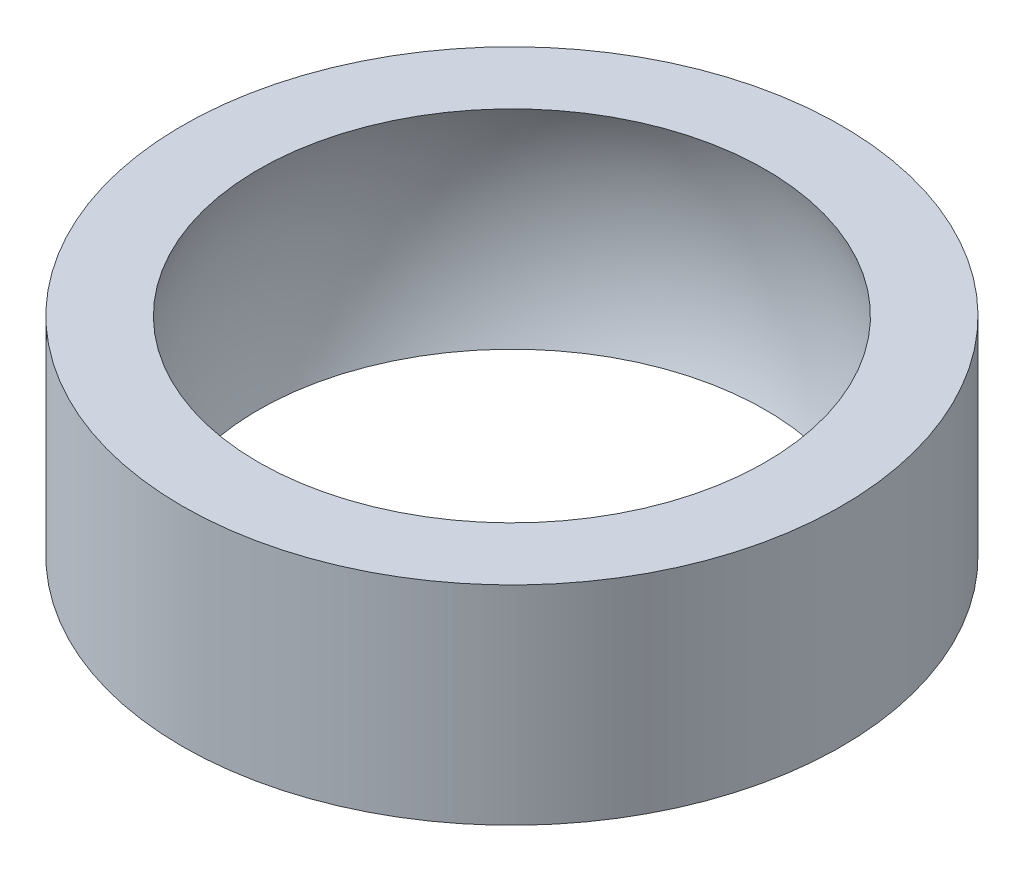
ISO-10303-21;
HEADER;
FILE_DESCRIPTION(('STEP AP214'),'2;1');
FILE_NAME('part.step','',(''),(''),'','','');
FILE_SCHEMA(('AUTOMOTIVE_DESIGN { 1 0 10303 214 1 1 1 1 }'));
ENDSEC;
DATA;
#1=APPLICATION_CONTEXT('core data for automotive mechanical design processes');
#2=APPLICATION_PROTOCOL_DEFINITION('international standard','automotive_design',2000,#1);
#3=PRODUCT_CONTEXT('',#1,'mechanical');
#4=PRODUCT('Part','Part','',(#3));
#5=PRODUCT_RELATED_PRODUCT_CATEGORY('part','',(#4));
#6=PRODUCT_DEFINITION_FORMATION('','',#4);
#7=PRODUCT_DEFINITION_CONTEXT('part definition',#1,'design');
#8=PRODUCT_DEFINITION('design','',#6,#7);
#9=PRODUCT_DEFINITION_SHAPE('','',#8);
#10=(LENGTH_UNIT() NAMED_UNIT(*) SI_UNIT(.MILLI.,.METRE.));
#11=(NAMED_UNIT(*) PLANE_ANGLE_UNIT() SI_UNIT($,.RADIAN.));
#12=(NAMED_UNIT(*) SI_UNIT($,.STERADIAN.) SOLID_ANGLE_UNIT());
#13=UNCERTAINTY_MEASURE_WITH_UNIT(LENGTH_MEASURE(1.E-05),#10,'distance_accuracy_value','');
#14=(GEOMETRIC_REPRESENTATION_CONTEXT(3) GLOBAL_UNCERTAINTY_ASSIGNED_CONTEXT((#13)) GLOBAL_UNIT_ASSIGNED_CONTEXT((#10,
#11,#12)) REPRESENTATION_CONTEXT('',''));
#15=CARTESIAN_POINT('',(0.,0.,0.));
#16=DIRECTION('',(0.,0.,1.));
#17=DIRECTION('',(1.,0.,0.));
#18=AXIS2_PLACEMENT_3D('',#15,#16,#17);
#19=CARTESIAN_POINT('',(0.,3.,0.));
#20=DIRECTION('',(0.,-1.,0.));
#21=DIRECTION('',(0.,0.,-1.));
#22=AXIS2_PLACEMENT_3D('',#19,#20,#21);
#23=CYLINDRICAL_SURFACE('',#22,9.5);
#24=CARTESIAN_POINT('',(0.,3.,0.));
#25=DIRECTION('',(0.,1.,0.));
#26=DIRECTION('',(0.,0.,1.));
#27=AXIS2_PLACEMENT_3D('',#24,#25,#26);
#28=CIRCLE('',#27,9.5);
#29=CARTESIAN_POINT('',(0.,3.,9.5));
#30=VERTEX_POINT('',#29);
#31=EDGE_CURVE('E10',#30,#30,#28,.T.);
#32=ORIENTED_EDGE('',*,*,#31,.F.);
#33=EDGE_LOOP('',(#32));
#34=FACE_BOUND('',#33,.T.);
#35=CARTESIAN_POINT('',(0.,-3.,0.));
#36=DIRECTION('',(0.,1.,0.));
#37=DIRECTION('',(0.,0.,1.));
#38=AXIS2_PLACEMENT_3D('',#35,#36,#37);
#39=CIRCLE('',#38,9.5);
#40=CARTESIAN_POINT('',(0.,-3.,9.5));
#41=VERTEX_POINT('',#40);
#42=EDGE_CURVE('E48',#41,#41,#39,.T.);
#43=ORIENTED_EDGE('',*,*,#42,.T.);
#44=EDGE_LOOP('',(#43));
#45=FACE_BOUND('',#44,.T.);
#46=ADVANCED_FACE('F41',(#34,#45),#23,.T.);
#47=CARTESIAN_POINT('',(0.,3.,0.));
#48=DIRECTION('',(0.,1.,0.));
#49=DIRECTION('',(0.,0.,1.));
#50=AXIS2_PLACEMENT_3D('',#47,#48,#49);
#51=PLANE('',#50);
#52=CARTESIAN_POINT('',(0.,3.,0.));
#53=DIRECTION('',(0.,1.,0.));
#54=DIRECTION('',(0.,0.,1.));
#55=AXIS2_PLACEMENT_3D('',#52,#53,#54);
#56=CIRCLE('',#55,7.30821455623739);
#57=CARTESIAN_POINT('',(0.,3.,7.30821455623739));
#58=VERTEX_POINT('',#57);
#59=EDGE_CURVE('E53',#58,#58,#56,.T.);
#60=ORIENTED_EDGE('',*,*,#59,.F.);
#61=EDGE_LOOP('',(#60));
#62=FACE_BOUND('',#61,.T.);
#63=ORIENTED_EDGE('',*,*,#31,.T.);
#64=EDGE_LOOP('',(#63));
#65=FACE_BOUND('',#64,.T.);
#66=ADVANCED_FACE('F70',(#62,#65),#51,.T.);
#67=CARTESIAN_POINT('',(0.,-3.,0.));
#68=DIRECTION('',(0.,1.,0.));
#69=DIRECTION('',(0.,0.,1.));
#70=AXIS2_PLACEMENT_3D('',#67,#68,#69);
#71=PLANE('',#70);
#72=CARTESIAN_POINT('',(0.,-3.,0.));
#73=DIRECTION('',(0.,1.,0.));
#74=DIRECTION('',(0.,0.,1.));
#75=AXIS2_PLACEMENT_3D('',#72,#73,#74);
#76=CIRCLE('',#75,7.30821455623739);
#77=CARTESIAN_POINT('',(0.,-3.,7.30821455623739));
#78=VERTEX_POINT('',#77);
#79=EDGE_CURVE('E44',#78,#78,#76,.T.);
#80=ORIENTED_EDGE('',*,*,#79,.T.);
#81=EDGE_LOOP('',(#80));
#82=FACE_BOUND('',#81,.T.);
#83=ORIENTED_EDGE('',*,*,#42,.F.);
#84=EDGE_LOOP('',(#83));
#85=FACE_BOUND('',#84,.T.);
#86=ADVANCED_FACE('F61',(#82,#85),#71,.F.);
#87=CARTESIAN_POINT('',(0.,0.,0.));
#88=DIRECTION('',(-1.,0.,0.));
#89=DIRECTION('',(0.,0.,-1.));
#90=AXIS2_PLACEMENT_3D('',#87,#88,#89);
#91=SPHERICAL_SURFACE('',#90,7.9);
#92=CARTESIAN_POINT('',(0.,0.,0.));
#93=DIRECTION('',(0.,1.,0.));
#94=DIRECTION('',(0.,0.,1.));
#95=AXIS2_PLACEMENT_3D('',#92,#93,#94);
#96=SPHERICAL_SURFACE('',#95,7.9);
#97=ORIENTED_EDGE('',*,*,#59,.T.);
#98=EDGE_LOOP('',(#97));
#99=FACE_BOUND('',#98,.T.);
#100=ORIENTED_EDGE('',*,*,#79,.F.);
#101=EDGE_LOOP('',(#100));
#102=FACE_BOUND('',#101,.T.);
#103=ADVANCED_FACE('F64',(#99,#102),#96,.F.);
#104=CLOSED_SHELL('',(#46,#66,#86,#103));
#105=MANIFOLD_SOLID_BREP('B2',#104);
#106=ADVANCED_BREP_SHAPE_REPRESENTATION('',(#18,#105),#14);
#107=SHAPE_DEFINITION_REPRESENTATION(#9,#106);
ENDSEC;
END-ISO-10303-21;
